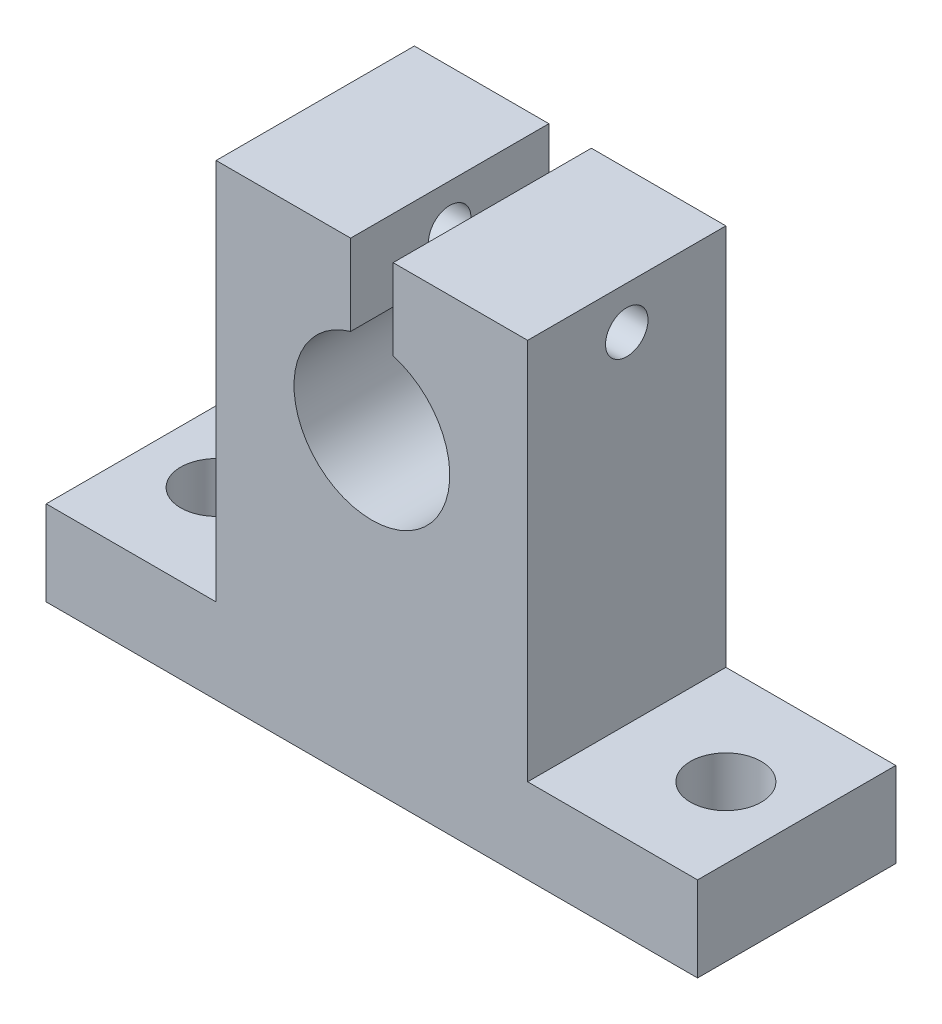
ISO-10303-21;
HEADER;
FILE_DESCRIPTION(('STEP AP214'),'2;1');
FILE_NAME('part.step','',(''),(''),'','','');
FILE_SCHEMA(('AUTOMOTIVE_DESIGN { 1 0 10303 214 1 1 1 1 }'));
ENDSEC;
DATA;
#1=APPLICATION_CONTEXT('core data for automotive mechanical design processes');
#2=APPLICATION_PROTOCOL_DEFINITION('international standard','automotive_design',2000,#1);
#3=PRODUCT_CONTEXT('',#1,'mechanical');
#4=PRODUCT('Part','Part','',(#3));
#5=PRODUCT_RELATED_PRODUCT_CATEGORY('part','',(#4));
#6=PRODUCT_DEFINITION_FORMATION('','',#4);
#7=PRODUCT_DEFINITION_CONTEXT('part definition',#1,'design');
#8=PRODUCT_DEFINITION('design','',#6,#7);
#9=PRODUCT_DEFINITION_SHAPE('','',#8);
#10=(LENGTH_UNIT() NAMED_UNIT(*) SI_UNIT(.MILLI.,.METRE.));
#11=(NAMED_UNIT(*) PLANE_ANGLE_UNIT() SI_UNIT($,.RADIAN.));
#12=(NAMED_UNIT(*) SI_UNIT($,.STERADIAN.) SOLID_ANGLE_UNIT());
#13=UNCERTAINTY_MEASURE_WITH_UNIT(LENGTH_MEASURE(1.E-05),#10,'distance_accuracy_value','');
#14=(GEOMETRIC_REPRESENTATION_CONTEXT(3) GLOBAL_UNCERTAINTY_ASSIGNED_CONTEXT((#13)) GLOBAL_UNIT_ASSIGNED_CONTEXT((#10,
#11,#12)) REPRESENTATION_CONTEXT('',''));
#15=CARTESIAN_POINT('',(0.,0.,0.));
#16=DIRECTION('',(0.,0.,1.));
#17=DIRECTION('',(1.,0.,0.));
#18=AXIS2_PLACEMENT_3D('',#15,#16,#17);
#19=CARTESIAN_POINT('',(-2.22651559810647,0.,14.));
#20=DIRECTION('',(1.,0.,0.));
#21=DIRECTION('',(0.,0.,-1.));
#22=AXIS2_PLACEMENT_3D('',#19,#20,#21);
#23=PLANE('',#22);
#24=DIRECTION('',(0.,0.,1.));
#25=VECTOR('',#24,1.);
#26=CARTESIAN_POINT('',(-2.22651559810647,11.0415026221292,-8.00000000000001));
#27=LINE('',#26,#25);
#28=CARTESIAN_POINT('',(-2.22651559810647,11.0415026221292,0.));
#29=VERTEX_POINT('',#28);
#30=CARTESIAN_POINT('',(-2.22651559810647,11.0415026221292,14.));
#31=VERTEX_POINT('',#30);
#32=EDGE_CURVE('E217',#29,#31,#27,.T.);
#33=ORIENTED_EDGE('',*,*,#32,.F.);
#34=DIRECTION('',(0.,-1.,0.));
#35=VECTOR('',#34,1.);
#36=CARTESIAN_POINT('',(-2.22651559810647,0.,0.));
#37=LINE('',#36,#35);
#38=CARTESIAN_POINT('',(-2.22651559810647,16.75,0.));
#39=VERTEX_POINT('',#38);
#40=EDGE_CURVE('E161',#39,#29,#37,.T.);
#41=ORIENTED_EDGE('',*,*,#40,.F.);
#42=DIRECTION('',(0.,0.,-1.));
#43=VECTOR('',#42,1.);
#44=CARTESIAN_POINT('',(-2.22651559810647,16.75,14.));
#45=LINE('',#44,#43);
#46=CARTESIAN_POINT('',(-2.22651559810647,16.75,14.));
#47=VERTEX_POINT('',#46);
#48=EDGE_CURVE('E44',#47,#39,#45,.T.);
#49=ORIENTED_EDGE('',*,*,#48,.F.);
#50=DIRECTION('',(0.,-1.,0.));
#51=VECTOR('',#50,1.);
#52=CARTESIAN_POINT('',(-2.22651559810647,0.,14.));
#53=LINE('',#52,#51);
#54=EDGE_CURVE('E187',#47,#31,#53,.T.);
#55=ORIENTED_EDGE('',*,*,#54,.T.);
#56=EDGE_LOOP('',(#33,#41,#49,#55));
#57=FACE_BOUND('',#56,.T.);
#58=CARTESIAN_POINT('',(-2.22651559810647,13.75,7.));
#59=DIRECTION('',(1.,0.,0.));
#60=DIRECTION('',(0.,0.,-1.));
#61=AXIS2_PLACEMENT_3D('',#58,#59,#60);
#62=CIRCLE('',#61,1.5);
#63=CARTESIAN_POINT('',(-2.22651559810647,13.75,5.5));
#64=VERTEX_POINT('',#63);
#65=EDGE_CURVE('E214',#64,#64,#62,.T.);
#66=ORIENTED_EDGE('',*,*,#65,.F.);
#67=EDGE_LOOP('',(#66));
#68=FACE_BOUND('',#67,.T.);
#69=ADVANCED_FACE('F37',(#57,#68),#23,.T.);
#70=CARTESIAN_POINT('',(0.,16.75,14.));
#71=DIRECTION('',(0.,1.,0.));
#72=DIRECTION('',(-1.,0.,0.));
#73=AXIS2_PLACEMENT_3D('',#70,#71,#72);
#74=PLANE('',#73);
#75=DIRECTION('',(1.,0.,0.));
#76=VECTOR('',#75,1.);
#77=CARTESIAN_POINT('',(0.,16.75,0.));
#78=LINE('',#77,#76);
#79=CARTESIAN_POINT('',(-11.7265155981065,16.75,0.));
#80=VERTEX_POINT('',#79);
#81=EDGE_CURVE('E164',#80,#39,#78,.T.);
#82=ORIENTED_EDGE('',*,*,#81,.F.);
#83=DIRECTION('',(0.,0.,-1.));
#84=VECTOR('',#83,1.);
#85=CARTESIAN_POINT('',(-11.7265155981065,16.75,14.));
#86=LINE('',#85,#84);
#87=CARTESIAN_POINT('',(-11.7265155981065,16.75,14.));
#88=VERTEX_POINT('',#87);
#89=EDGE_CURVE('E201',#88,#80,#86,.T.);
#90=ORIENTED_EDGE('',*,*,#89,.F.);
#91=DIRECTION('',(1.,0.,0.));
#92=VECTOR('',#91,1.);
#93=CARTESIAN_POINT('',(0.,16.75,14.));
#94=LINE('',#93,#92);
#95=EDGE_CURVE('E156',#88,#47,#94,.T.);
#96=ORIENTED_EDGE('',*,*,#95,.T.);
#97=ORIENTED_EDGE('',*,*,#48,.T.);
#98=EDGE_LOOP('',(#82,#90,#96,#97));
#99=FACE_BOUND('',#98,.T.);
#100=ADVANCED_FACE('F270',(#99),#74,.T.);
#101=CARTESIAN_POINT('',(-11.7265155981065,0.,14.));
#102=DIRECTION('',(1.,0.,0.));
#103=DIRECTION('',(0.,1.,0.));
#104=AXIS2_PLACEMENT_3D('',#101,#102,#103);
#105=PLANE('',#104);
#106=CARTESIAN_POINT('',(-11.7265155981065,13.75,7.));
#107=DIRECTION('',(-1.,0.,0.));
#108=DIRECTION('',(0.,-1.,0.));
#109=AXIS2_PLACEMENT_3D('',#106,#107,#108);
#110=CIRCLE('',#109,1.5);
#111=CARTESIAN_POINT('',(-11.7265155981065,12.25,7.));
#112=VERTEX_POINT('',#111);
#113=EDGE_CURVE('E210',#112,#112,#110,.T.);
#114=ORIENTED_EDGE('',*,*,#113,.F.);
#115=EDGE_LOOP('',(#114));
#116=FACE_BOUND('',#115,.T.);
#117=DIRECTION('',(0.,-1.,0.));
#118=VECTOR('',#117,1.);
#119=CARTESIAN_POINT('',(-11.7265155981065,0.,0.));
#120=LINE('',#119,#118);
#121=CARTESIAN_POINT('',(-11.7265155981065,-10.25,0.));
#122=VERTEX_POINT('',#121);
#123=EDGE_CURVE('E168',#80,#122,#120,.T.);
#124=ORIENTED_EDGE('',*,*,#123,.T.);
#125=DIRECTION('',(0.,0.,-1.));
#126=VECTOR('',#125,1.);
#127=CARTESIAN_POINT('',(-11.7265155981065,-10.25,14.));
#128=LINE('',#127,#126);
#129=CARTESIAN_POINT('',(-11.7265155981065,-10.25,14.));
#130=VERTEX_POINT('',#129);
#131=EDGE_CURVE('E198',#130,#122,#128,.T.);
#132=ORIENTED_EDGE('',*,*,#131,.F.);
#133=DIRECTION('',(0.,-1.,0.));
#134=VECTOR('',#133,1.);
#135=CARTESIAN_POINT('',(-11.7265155981065,0.,14.));
#136=LINE('',#135,#134);
#137=EDGE_CURVE('E236',#88,#130,#136,.T.);
#138=ORIENTED_EDGE('',*,*,#137,.F.);
#139=ORIENTED_EDGE('',*,*,#89,.T.);
#140=EDGE_LOOP('',(#124,#132,#138,#139));
#141=FACE_BOUND('',#140,.T.);
#142=ADVANCED_FACE('F277',(#116,#141),#105,.F.);
#143=CARTESIAN_POINT('',(0.,-10.25,14.));
#144=DIRECTION('',(0.,-1.,0.));
#145=DIRECTION('',(1.,0.,0.));
#146=AXIS2_PLACEMENT_3D('',#143,#144,#145);
#147=PLANE('',#146);
#148=CARTESIAN_POINT('',(-18.7265155981065,-10.25,7.));
#149=DIRECTION('',(0.,-1.,0.));
#150=DIRECTION('',(1.,0.,0.));
#151=AXIS2_PLACEMENT_3D('',#148,#149,#150);
#152=CIRCLE('',#151,2.5);
#153=CARTESIAN_POINT('',(-16.2265155981065,-10.25,7.));
#154=VERTEX_POINT('',#153);
#155=EDGE_CURVE('E165',#154,#154,#152,.T.);
#156=ORIENTED_EDGE('',*,*,#155,.T.);
#157=EDGE_LOOP('',(#156));
#158=FACE_BOUND('',#157,.T.);
#159=DIRECTION('',(-1.,0.,0.));
#160=VECTOR('',#159,1.);
#161=CARTESIAN_POINT('',(0.,-10.25,0.));
#162=LINE('',#161,#160);
#163=CARTESIAN_POINT('',(-23.7265155981065,-10.25,0.));
#164=VERTEX_POINT('',#163);
#165=EDGE_CURVE('E171',#122,#164,#162,.T.);
#166=ORIENTED_EDGE('',*,*,#165,.T.);
#167=DIRECTION('',(0.,0.,-1.));
#168=VECTOR('',#167,1.);
#169=CARTESIAN_POINT('',(-23.7265155981065,-10.25,14.));
#170=LINE('',#169,#168);
#171=CARTESIAN_POINT('',(-23.7265155981065,-10.25,14.));
#172=VERTEX_POINT('',#171);
#173=EDGE_CURVE('E196',#172,#164,#170,.T.);
#174=ORIENTED_EDGE('',*,*,#173,.F.);
#175=DIRECTION('',(-1.,0.,0.));
#176=VECTOR('',#175,1.);
#177=CARTESIAN_POINT('',(0.,-10.25,14.));
#178=LINE('',#177,#176);
#179=EDGE_CURVE('E238',#130,#172,#178,.T.);
#180=ORIENTED_EDGE('',*,*,#179,.F.);
#181=ORIENTED_EDGE('',*,*,#131,.T.);
#182=EDGE_LOOP('',(#166,#174,#180,#181));
#183=FACE_BOUND('',#182,.T.);
#184=ADVANCED_FACE('F279',(#158,#183),#147,.F.);
#185=CARTESIAN_POINT('',(-23.7265155981065,0.,14.));
#186=DIRECTION('',(-1.,0.,0.));
#187=DIRECTION('',(0.,0.,1.));
#188=AXIS2_PLACEMENT_3D('',#185,#186,#187);
#189=PLANE('',#188);
#190=DIRECTION('',(0.,1.,0.));
#191=VECTOR('',#190,1.);
#192=CARTESIAN_POINT('',(-23.7265155981065,0.,0.));
#193=LINE('',#192,#191);
#194=CARTESIAN_POINT('',(-23.7265155981065,-16.25,0.));
#195=VERTEX_POINT('',#194);
#196=EDGE_CURVE('E174',#195,#164,#193,.T.);
#197=ORIENTED_EDGE('',*,*,#196,.F.);
#198=DIRECTION('',(0.,0.,-1.));
#199=VECTOR('',#198,1.);
#200=CARTESIAN_POINT('',(-23.7265155981065,-16.25,14.));
#201=LINE('',#200,#199);
#202=CARTESIAN_POINT('',(-23.7265155981065,-16.25,14.));
#203=VERTEX_POINT('',#202);
#204=EDGE_CURVE('E194',#203,#195,#201,.T.);
#205=ORIENTED_EDGE('',*,*,#204,.F.);
#206=DIRECTION('',(0.,1.,0.));
#207=VECTOR('',#206,1.);
#208=CARTESIAN_POINT('',(-23.7265155981065,0.,14.));
#209=LINE('',#208,#207);
#210=EDGE_CURVE('E240',#203,#172,#209,.T.);
#211=ORIENTED_EDGE('',*,*,#210,.T.);
#212=ORIENTED_EDGE('',*,*,#173,.T.);
#213=EDGE_LOOP('',(#197,#205,#211,#212));
#214=FACE_BOUND('',#213,.T.);
#215=ADVANCED_FACE('F282',(#214),#189,.T.);
#216=CARTESIAN_POINT('',(0.,-16.25,14.));
#217=DIRECTION('',(0.,1.,0.));
#218=DIRECTION('',(-1.,0.,0.));
#219=AXIS2_PLACEMENT_3D('',#216,#217,#218);
#220=PLANE('',#219);
#221=CARTESIAN_POINT('',(-18.7265155981065,-16.25,7.));
#222=DIRECTION('',(0.,-1.,0.));
#223=DIRECTION('',(1.,0.,0.));
#224=AXIS2_PLACEMENT_3D('',#221,#222,#223);
#225=CIRCLE('',#224,2.5);
#226=CARTESIAN_POINT('',(-16.2265155981065,-16.25,7.));
#227=VERTEX_POINT('',#226);
#228=EDGE_CURVE('E206',#227,#227,#225,.T.);
#229=ORIENTED_EDGE('',*,*,#228,.F.);
#230=EDGE_LOOP('',(#229));
#231=FACE_BOUND('',#230,.T.);
#232=CARTESIAN_POINT('',(17.2734844018935,-16.25,7.));
#233=DIRECTION('',(0.,-1.,0.));
#234=DIRECTION('',(-1.,0.,0.));
#235=AXIS2_PLACEMENT_3D('',#232,#233,#234);
#236=CIRCLE('',#235,2.5);
#237=CARTESIAN_POINT('',(14.7734844018935,-16.25,7.));
#238=VERTEX_POINT('',#237);
#239=EDGE_CURVE('E227',#238,#238,#236,.T.);
#240=ORIENTED_EDGE('',*,*,#239,.F.);
#241=EDGE_LOOP('',(#240));
#242=FACE_BOUND('',#241,.T.);
#243=DIRECTION('',(1.,0.,0.));
#244=VECTOR('',#243,1.);
#245=CARTESIAN_POINT('',(0.,-16.25,0.));
#246=LINE('',#245,#244);
#247=CARTESIAN_POINT('',(22.2734844018935,-16.25,0.));
#248=VERTEX_POINT('',#247);
#249=EDGE_CURVE('E177',#195,#248,#246,.T.);
#250=ORIENTED_EDGE('',*,*,#249,.T.);
#251=DIRECTION('',(0.,0.,-1.));
#252=VECTOR('',#251,1.);
#253=CARTESIAN_POINT('',(22.2734844018935,-16.25,14.));
#254=LINE('',#253,#252);
#255=CARTESIAN_POINT('',(22.2734844018935,-16.25,14.));
#256=VERTEX_POINT('',#255);
#257=EDGE_CURVE('E191',#256,#248,#254,.T.);
#258=ORIENTED_EDGE('',*,*,#257,.F.);
#259=DIRECTION('',(1.,0.,0.));
#260=VECTOR('',#259,1.);
#261=CARTESIAN_POINT('',(0.,-16.25,14.));
#262=LINE('',#261,#260);
#263=EDGE_CURVE('E243',#203,#256,#262,.T.);
#264=ORIENTED_EDGE('',*,*,#263,.F.);
#265=ORIENTED_EDGE('',*,*,#204,.T.);
#266=EDGE_LOOP('',(#250,#258,#264,#265));
#267=FACE_BOUND('',#266,.T.);
#268=ADVANCED_FACE('F248',(#231,#242,#267),#220,.F.);
#269=CARTESIAN_POINT('',(22.2734844018935,0.,14.));
#270=DIRECTION('',(-1.,0.,0.));
#271=DIRECTION('',(0.,0.,1.));
#272=AXIS2_PLACEMENT_3D('',#269,#270,#271);
#273=PLANE('',#272);
#274=DIRECTION('',(0.,1.,0.));
#275=VECTOR('',#274,1.);
#276=CARTESIAN_POINT('',(22.2734844018935,0.,0.));
#277=LINE('',#276,#275);
#278=CARTESIAN_POINT('',(22.2734844018935,-10.25,0.));
#279=VERTEX_POINT('',#278);
#280=EDGE_CURVE('E179',#248,#279,#277,.T.);
#281=ORIENTED_EDGE('',*,*,#280,.T.);
#282=DIRECTION('',(0.,0.,-1.));
#283=VECTOR('',#282,1.);
#284=CARTESIAN_POINT('',(22.2734844018935,-10.25,14.));
#285=LINE('',#284,#283);
#286=CARTESIAN_POINT('',(22.2734844018935,-10.25,14.));
#287=VERTEX_POINT('',#286);
#288=EDGE_CURVE('E138',#287,#279,#285,.T.);
#289=ORIENTED_EDGE('',*,*,#288,.F.);
#290=DIRECTION('',(0.,1.,0.));
#291=VECTOR('',#290,1.);
#292=CARTESIAN_POINT('',(22.2734844018935,0.,14.));
#293=LINE('',#292,#291);
#294=EDGE_CURVE('E148',#256,#287,#293,.T.);
#295=ORIENTED_EDGE('',*,*,#294,.F.);
#296=ORIENTED_EDGE('',*,*,#257,.T.);
#297=EDGE_LOOP('',(#281,#289,#295,#296));
#298=FACE_BOUND('',#297,.T.);
#299=ADVANCED_FACE('F252',(#298),#273,.F.);
#300=CARTESIAN_POINT('',(0.,-10.25,14.));
#301=DIRECTION('',(0.,1.,0.));
#302=DIRECTION('',(0.,0.,1.));
#303=AXIS2_PLACEMENT_3D('',#300,#301,#302);
#304=PLANE('',#303);
#305=CARTESIAN_POINT('',(17.2734844018935,-10.25,7.));
#306=DIRECTION('',(0.,1.,0.));
#307=DIRECTION('',(0.,0.,1.));
#308=AXIS2_PLACEMENT_3D('',#305,#306,#307);
#309=CIRCLE('',#308,2.5);
#310=CARTESIAN_POINT('',(17.2734844018935,-10.25,9.5));
#311=VERTEX_POINT('',#310);
#312=EDGE_CURVE('E204',#311,#311,#309,.T.);
#313=ORIENTED_EDGE('',*,*,#312,.F.);
#314=EDGE_LOOP('',(#313));
#315=FACE_BOUND('',#314,.T.);
#316=DIRECTION('',(1.,0.,0.));
#317=VECTOR('',#316,1.);
#318=CARTESIAN_POINT('',(0.,-10.25,0.));
#319=LINE('',#318,#317);
#320=CARTESIAN_POINT('',(10.2734844018935,-10.25,0.));
#321=VERTEX_POINT('',#320);
#322=EDGE_CURVE('E133',#321,#279,#319,.T.);
#323=ORIENTED_EDGE('',*,*,#322,.F.);
#324=DIRECTION('',(0.,0.,-1.));
#325=VECTOR('',#324,1.);
#326=CARTESIAN_POINT('',(10.2734844018935,-10.25,14.));
#327=LINE('',#326,#325);
#328=CARTESIAN_POINT('',(10.2734844018935,-10.25,14.));
#329=VERTEX_POINT('',#328);
#330=EDGE_CURVE('E128',#329,#321,#327,.T.);
#331=ORIENTED_EDGE('',*,*,#330,.F.);
#332=DIRECTION('',(1.,0.,0.));
#333=VECTOR('',#332,1.);
#334=CARTESIAN_POINT('',(0.,-10.25,14.));
#335=LINE('',#334,#333);
#336=EDGE_CURVE('E131',#329,#287,#335,.T.);
#337=ORIENTED_EDGE('',*,*,#336,.T.);
#338=ORIENTED_EDGE('',*,*,#288,.T.);
#339=EDGE_LOOP('',(#323,#331,#337,#338));
#340=FACE_BOUND('',#339,.T.);
#341=ADVANCED_FACE('F130',(#315,#340),#304,.T.);
#342=CARTESIAN_POINT('',(10.2734844018935,0.,14.));
#343=DIRECTION('',(1.,0.,0.));
#344=DIRECTION('',(0.,1.,0.));
#345=AXIS2_PLACEMENT_3D('',#342,#343,#344);
#346=PLANE('',#345);
#347=CARTESIAN_POINT('',(10.2734844018935,13.75,7.));
#348=DIRECTION('',(1.,0.,0.));
#349=DIRECTION('',(0.,1.,0.));
#350=AXIS2_PLACEMENT_3D('',#347,#348,#349);
#351=CIRCLE('',#350,1.5);
#352=CARTESIAN_POINT('',(10.2734844018935,15.25,7.));
#353=VERTEX_POINT('',#352);
#354=EDGE_CURVE('E209',#353,#353,#351,.T.);
#355=ORIENTED_EDGE('',*,*,#354,.F.);
#356=EDGE_LOOP('',(#355));
#357=FACE_BOUND('',#356,.T.);
#358=DIRECTION('',(0.,-1.,0.));
#359=VECTOR('',#358,1.);
#360=CARTESIAN_POINT('',(10.2734844018935,0.,0.));
#361=LINE('',#360,#359);
#362=CARTESIAN_POINT('',(10.2734844018935,16.75,0.));
#363=VERTEX_POINT('',#362);
#364=EDGE_CURVE('E183',#363,#321,#361,.T.);
#365=ORIENTED_EDGE('',*,*,#364,.F.);
#366=DIRECTION('',(0.,0.,-1.));
#367=VECTOR('',#366,1.);
#368=CARTESIAN_POINT('',(10.2734844018935,16.75,14.));
#369=LINE('',#368,#367);
#370=CARTESIAN_POINT('',(10.2734844018935,16.75,14.));
#371=VERTEX_POINT('',#370);
#372=EDGE_CURVE('E139',#371,#363,#369,.T.);
#373=ORIENTED_EDGE('',*,*,#372,.F.);
#374=DIRECTION('',(0.,-1.,0.));
#375=VECTOR('',#374,1.);
#376=CARTESIAN_POINT('',(10.2734844018935,0.,14.));
#377=LINE('',#376,#375);
#378=EDGE_CURVE('E146',#371,#329,#377,.T.);
#379=ORIENTED_EDGE('',*,*,#378,.T.);
#380=ORIENTED_EDGE('',*,*,#330,.T.);
#381=EDGE_LOOP('',(#365,#373,#379,#380));
#382=FACE_BOUND('',#381,.T.);
#383=ADVANCED_FACE('F151',(#357,#382),#346,.T.);
#384=CARTESIAN_POINT('',(0.773484401893536,16.75,0.));
#385=VERTEX_POINT('',#384);
#386=EDGE_CURVE('E169',#385,#363,#78,.T.);
#387=ORIENTED_EDGE('',*,*,#386,.F.);
#388=DIRECTION('',(0.,0.,-1.));
#389=VECTOR('',#388,1.);
#390=CARTESIAN_POINT('',(0.773484401893536,16.75,14.));
#391=LINE('',#390,#389);
#392=CARTESIAN_POINT('',(0.773484401893536,16.75,14.));
#393=VERTEX_POINT('',#392);
#394=EDGE_CURVE('E59',#393,#385,#391,.T.);
#395=ORIENTED_EDGE('',*,*,#394,.F.);
#396=EDGE_CURVE('E152',#393,#371,#94,.T.);
#397=ORIENTED_EDGE('',*,*,#396,.T.);
#398=ORIENTED_EDGE('',*,*,#372,.T.);
#399=EDGE_LOOP('',(#387,#395,#397,#398));
#400=FACE_BOUND('',#399,.T.);
#401=ADVANCED_FACE('F256',(#400),#74,.T.);
#402=CARTESIAN_POINT('',(0.773484401893538,0.,14.));
#403=DIRECTION('',(1.,0.,0.));
#404=DIRECTION('',(0.,1.,0.));
#405=AXIS2_PLACEMENT_3D('',#402,#403,#404);
#406=PLANE('',#405);
#407=CARTESIAN_POINT('',(0.773484401893535,13.75,7.));
#408=DIRECTION('',(1.,0.,0.));
#409=DIRECTION('',(0.,1.,0.));
#410=AXIS2_PLACEMENT_3D('',#407,#408,#409);
#411=CIRCLE('',#410,1.5);
#412=CARTESIAN_POINT('',(0.773484401893535,15.25,7.));
#413=VERTEX_POINT('',#412);
#414=EDGE_CURVE('E207',#413,#413,#411,.T.);
#415=ORIENTED_EDGE('',*,*,#414,.T.);
#416=EDGE_LOOP('',(#415));
#417=FACE_BOUND('',#416,.T.);
#418=DIRECTION('',(0.,-1.,0.));
#419=VECTOR('',#418,1.);
#420=CARTESIAN_POINT('',(0.773484401893538,0.,0.));
#421=LINE('',#420,#419);
#422=CARTESIAN_POINT('',(0.773484401893536,11.0415026221292,0.));
#423=VERTEX_POINT('',#422);
#424=EDGE_CURVE('E185',#385,#423,#421,.T.);
#425=ORIENTED_EDGE('',*,*,#424,.T.);
#426=DIRECTION('',(0.,0.,1.));
#427=VECTOR('',#426,1.);
#428=CARTESIAN_POINT('',(0.773484401893536,11.0415026221292,-8.00000000000001));
#429=LINE('',#428,#427);
#430=CARTESIAN_POINT('',(0.773484401893536,11.0415026221292,14.));
#431=VERTEX_POINT('',#430);
#432=EDGE_CURVE('E51',#423,#431,#429,.T.);
#433=ORIENTED_EDGE('',*,*,#432,.T.);
#434=DIRECTION('',(0.,-1.,0.));
#435=VECTOR('',#434,1.);
#436=CARTESIAN_POINT('',(0.773484401893538,0.,14.));
#437=LINE('',#436,#435);
#438=EDGE_CURVE('E154',#393,#431,#437,.T.);
#439=ORIENTED_EDGE('',*,*,#438,.F.);
#440=ORIENTED_EDGE('',*,*,#394,.T.);
#441=EDGE_LOOP('',(#425,#433,#439,#440));
#442=FACE_BOUND('',#441,.T.);
#443=ADVANCED_FACE('F261',(#417,#442),#406,.F.);
#444=CARTESIAN_POINT('',(0.,0.,14.));
#445=DIRECTION('',(0.,0.,1.));
#446=DIRECTION('',(1.,0.,0.));
#447=AXIS2_PLACEMENT_3D('',#444,#445,#446);
#448=PLANE('',#447);
#449=CARTESIAN_POINT('',(-0.726515598106461,5.74999999999998,14.));
#450=DIRECTION('',(0.,0.,1.));
#451=DIRECTION('',(1.,0.,0.));
#452=AXIS2_PLACEMENT_3D('',#449,#450,#451);
#453=CIRCLE('',#452,5.5);
#454=EDGE_CURVE('E259',#31,#431,#453,.T.);
#455=ORIENTED_EDGE('',*,*,#454,.F.);
#456=ORIENTED_EDGE('',*,*,#54,.F.);
#457=ORIENTED_EDGE('',*,*,#95,.F.);
#458=ORIENTED_EDGE('',*,*,#137,.T.);
#459=ORIENTED_EDGE('',*,*,#179,.T.);
#460=ORIENTED_EDGE('',*,*,#210,.F.);
#461=ORIENTED_EDGE('',*,*,#263,.T.);
#462=ORIENTED_EDGE('',*,*,#294,.T.);
#463=ORIENTED_EDGE('',*,*,#336,.F.);
#464=ORIENTED_EDGE('',*,*,#378,.F.);
#465=ORIENTED_EDGE('',*,*,#396,.F.);
#466=ORIENTED_EDGE('',*,*,#438,.T.);
#467=EDGE_LOOP('',(#455,#456,#457,#458,#459,#460,#461,#462,#463,#464,#465,#466));
#468=FACE_BOUND('',#467,.T.);
#469=ADVANCED_FACE('F144',(#468),#448,.T.);
#470=CARTESIAN_POINT('',(0.,0.,0.));
#471=DIRECTION('',(0.,0.,1.));
#472=DIRECTION('',(1.,0.,0.));
#473=AXIS2_PLACEMENT_3D('',#470,#471,#472);
#474=PLANE('',#473);
#475=ORIENTED_EDGE('',*,*,#40,.T.);
#476=CARTESIAN_POINT('',(-0.726515598106461,5.74999999999998,0.));
#477=DIRECTION('',(0.,0.,1.));
#478=DIRECTION('',(1.,0.,0.));
#479=AXIS2_PLACEMENT_3D('',#476,#477,#478);
#480=CIRCLE('',#479,5.5);
#481=EDGE_CURVE('E11',#29,#423,#480,.T.);
#482=ORIENTED_EDGE('',*,*,#481,.T.);
#483=ORIENTED_EDGE('',*,*,#424,.F.);
#484=ORIENTED_EDGE('',*,*,#386,.T.);
#485=ORIENTED_EDGE('',*,*,#364,.T.);
#486=ORIENTED_EDGE('',*,*,#322,.T.);
#487=ORIENTED_EDGE('',*,*,#280,.F.);
#488=ORIENTED_EDGE('',*,*,#249,.F.);
#489=ORIENTED_EDGE('',*,*,#196,.T.);
#490=ORIENTED_EDGE('',*,*,#165,.F.);
#491=ORIENTED_EDGE('',*,*,#123,.F.);
#492=ORIENTED_EDGE('',*,*,#81,.T.);
#493=EDGE_LOOP('',(#475,#482,#483,#484,#485,#486,#487,#488,#489,#490,#491,#492));
#494=FACE_BOUND('',#493,.T.);
#495=ADVANCED_FACE('F254',(#494),#474,.F.);
#496=CARTESIAN_POINT('',(17.2734844018935,-2.25,7.));
#497=DIRECTION('',(0.,-1.,0.));
#498=DIRECTION('',(1.,0.,0.));
#499=AXIS2_PLACEMENT_3D('',#496,#497,#498);
#500=CYLINDRICAL_SURFACE('',#499,2.5);
#501=ORIENTED_EDGE('',*,*,#312,.T.);
#502=EDGE_LOOP('',(#501));
#503=FACE_BOUND('',#502,.T.);
#504=ORIENTED_EDGE('',*,*,#239,.T.);
#505=EDGE_LOOP('',(#504));
#506=FACE_BOUND('',#505,.T.);
#507=ADVANCED_FACE('F337',(#503,#506),#500,.F.);
#508=CARTESIAN_POINT('',(-18.7265155981065,-2.25000000000001,7.));
#509=DIRECTION('',(0.,-1.,0.));
#510=DIRECTION('',(1.,0.,0.));
#511=AXIS2_PLACEMENT_3D('',#508,#509,#510);
#512=CYLINDRICAL_SURFACE('',#511,2.5);
#513=ORIENTED_EDGE('',*,*,#228,.T.);
#514=EDGE_LOOP('',(#513));
#515=FACE_BOUND('',#514,.T.);
#516=ORIENTED_EDGE('',*,*,#155,.F.);
#517=EDGE_LOOP('',(#516));
#518=FACE_BOUND('',#517,.T.);
#519=ADVANCED_FACE('F342',(#515,#518),#512,.F.);
#520=CARTESIAN_POINT('',(16.2734844018935,13.75,7.));
#521=DIRECTION('',(-1.,0.,0.));
#522=DIRECTION('',(0.,-1.,0.));
#523=AXIS2_PLACEMENT_3D('',#520,#521,#522);
#524=CYLINDRICAL_SURFACE('',#523,1.5);
#525=ORIENTED_EDGE('',*,*,#354,.T.);
#526=EDGE_LOOP('',(#525));
#527=FACE_BOUND('',#526,.T.);
#528=ORIENTED_EDGE('',*,*,#414,.F.);
#529=EDGE_LOOP('',(#528));
#530=FACE_BOUND('',#529,.T.);
#531=ADVANCED_FACE('F354',(#527,#530),#524,.F.);
#532=ORIENTED_EDGE('',*,*,#65,.T.);
#533=EDGE_LOOP('',(#532));
#534=FACE_BOUND('',#533,.T.);
#535=ORIENTED_EDGE('',*,*,#113,.T.);
#536=EDGE_LOOP('',(#535));
#537=FACE_BOUND('',#536,.T.);
#538=ADVANCED_FACE('F376',(#534,#537),#524,.F.);
#539=CARTESIAN_POINT('',(-0.726515598106461,5.74999999999998,-8.00000000000001));
#540=DIRECTION('',(0.,0.,1.));
#541=DIRECTION('',(1.,0.,0.));
#542=AXIS2_PLACEMENT_3D('',#539,#540,#541);
#543=CYLINDRICAL_SURFACE('',#542,5.5);
#544=ORIENTED_EDGE('',*,*,#32,.T.);
#545=ORIENTED_EDGE('',*,*,#454,.T.);
#546=ORIENTED_EDGE('',*,*,#432,.F.);
#547=ORIENTED_EDGE('',*,*,#481,.F.);
#548=EDGE_LOOP('',(#544,#545,#546,#547));
#549=FACE_BOUND('',#548,.T.);
#550=ADVANCED_FACE('F263',(#549),#543,.F.);
#551=CLOSED_SHELL('',(#69,#100,#142,#184,#215,#268,#299,#341,#383,#401,#443,#469,#495,#507,#519,
#531,#538,#550));
#552=MANIFOLD_SOLID_BREP('B2',#551);
#553=ADVANCED_BREP_SHAPE_REPRESENTATION('',(#18,#552),#14);
#554=SHAPE_DEFINITION_REPRESENTATION(#9,#553);
ENDSEC;
END-ISO-10303-21;
